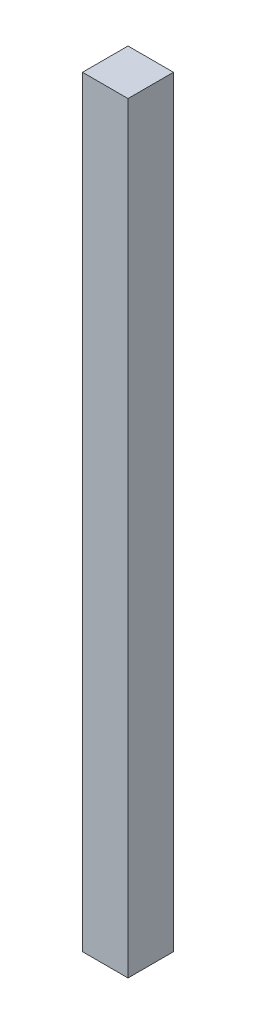
ISO-10303-21;
HEADER;
FILE_DESCRIPTION(('STEP AP214'),'2;1');
FILE_NAME('part.step','',(''),(''),'','','');
FILE_SCHEMA(('AUTOMOTIVE_DESIGN { 1 0 10303 214 1 1 1 1 }'));
ENDSEC;
DATA;
#1=APPLICATION_CONTEXT('core data for automotive mechanical design processes');
#2=APPLICATION_PROTOCOL_DEFINITION('international standard','automotive_design',2000,#1);
#3=PRODUCT_CONTEXT('',#1,'mechanical');
#4=PRODUCT('Part','Part','',(#3));
#5=PRODUCT_RELATED_PRODUCT_CATEGORY('part','',(#4));
#6=PRODUCT_DEFINITION_FORMATION('','',#4);
#7=PRODUCT_DEFINITION_CONTEXT('part definition',#1,'design');
#8=PRODUCT_DEFINITION('design','',#6,#7);
#9=PRODUCT_DEFINITION_SHAPE('','',#8);
#10=(LENGTH_UNIT() NAMED_UNIT(*) SI_UNIT(.MILLI.,.METRE.));
#11=(NAMED_UNIT(*) PLANE_ANGLE_UNIT() SI_UNIT($,.RADIAN.));
#12=(NAMED_UNIT(*) SI_UNIT($,.STERADIAN.) SOLID_ANGLE_UNIT());
#13=UNCERTAINTY_MEASURE_WITH_UNIT(LENGTH_MEASURE(1.E-05),#10,'distance_accuracy_value','');
#14=(GEOMETRIC_REPRESENTATION_CONTEXT(3) GLOBAL_UNCERTAINTY_ASSIGNED_CONTEXT((#13)) GLOBAL_UNIT_ASSIGNED_CONTEXT((#10,
#11,#12)) REPRESENTATION_CONTEXT('',''));
#15=CARTESIAN_POINT('',(0.,0.,0.));
#16=DIRECTION('',(0.,0.,1.));
#17=DIRECTION('',(1.,0.,0.));
#18=AXIS2_PLACEMENT_3D('',#15,#16,#17);
#19=CARTESIAN_POINT('',(25.4,850.392,25.4));
#20=DIRECTION('',(-1.,0.,0.));
#21=DIRECTION('',(0.,0.,1.));
#22=AXIS2_PLACEMENT_3D('',#19,#20,#21);
#23=PLANE('',#22);
#24=DIRECTION('',(0.,0.,-1.));
#25=VECTOR('',#24,1.);
#26=CARTESIAN_POINT('',(25.4,0.,25.4));
#27=LINE('',#26,#25);
#28=CARTESIAN_POINT('',(25.4,0.,25.4));
#29=VERTEX_POINT('',#28);
#30=CARTESIAN_POINT('',(25.4,0.,-25.4));
#31=VERTEX_POINT('',#30);
#32=EDGE_CURVE('E111',#29,#31,#27,.T.);
#33=ORIENTED_EDGE('',*,*,#32,.T.);
#34=DIRECTION('',(0.,-1.,0.));
#35=VECTOR('',#34,1.);
#36=CARTESIAN_POINT('',(25.4,850.392,-25.4));
#37=LINE('',#36,#35);
#38=CARTESIAN_POINT('',(25.4,850.392,-25.4));
#39=VERTEX_POINT('',#38);
#40=EDGE_CURVE('E11',#39,#31,#37,.T.);
#41=ORIENTED_EDGE('',*,*,#40,.F.);
#42=DIRECTION('',(0.,0.,-1.));
#43=VECTOR('',#42,1.);
#44=CARTESIAN_POINT('',(25.4,850.392,25.4));
#45=LINE('',#44,#43);
#46=CARTESIAN_POINT('',(25.4,850.392,25.4));
#47=VERTEX_POINT('',#46);
#48=EDGE_CURVE('E95',#47,#39,#45,.T.);
#49=ORIENTED_EDGE('',*,*,#48,.F.);
#50=DIRECTION('',(0.,-1.,0.));
#51=VECTOR('',#50,1.);
#52=CARTESIAN_POINT('',(25.4,850.392,25.4));
#53=LINE('',#52,#51);
#54=EDGE_CURVE('E107',#47,#29,#53,.T.);
#55=ORIENTED_EDGE('',*,*,#54,.T.);
#56=EDGE_LOOP('',(#33,#41,#49,#55));
#57=FACE_BOUND('',#56,.T.);
#58=ADVANCED_FACE('F43',(#57),#23,.F.);
#59=CARTESIAN_POINT('',(-25.4,850.392,-25.4));
#60=DIRECTION('',(0.,0.,1.));
#61=DIRECTION('',(1.,0.,0.));
#62=AXIS2_PLACEMENT_3D('',#59,#60,#61);
#63=PLANE('',#62);
#64=DIRECTION('',(-1.,0.,0.));
#65=VECTOR('',#64,1.);
#66=CARTESIAN_POINT('',(-25.4,0.,-25.4));
#67=LINE('',#66,#65);
#68=CARTESIAN_POINT('',(-25.4,0.,-25.4));
#69=VERTEX_POINT('',#68);
#70=EDGE_CURVE('E100',#31,#69,#67,.T.);
#71=ORIENTED_EDGE('',*,*,#70,.T.);
#72=DIRECTION('',(0.,-1.,0.));
#73=VECTOR('',#72,1.);
#74=CARTESIAN_POINT('',(-25.4,850.392,-25.4));
#75=LINE('',#74,#73);
#76=CARTESIAN_POINT('',(-25.4,850.392,-25.4));
#77=VERTEX_POINT('',#76);
#78=EDGE_CURVE('E52',#77,#69,#75,.T.);
#79=ORIENTED_EDGE('',*,*,#78,.F.);
#80=DIRECTION('',(-1.,0.,0.));
#81=VECTOR('',#80,1.);
#82=CARTESIAN_POINT('',(-25.4,850.392,-25.4));
#83=LINE('',#82,#81);
#84=EDGE_CURVE('E90',#39,#77,#83,.T.);
#85=ORIENTED_EDGE('',*,*,#84,.F.);
#86=ORIENTED_EDGE('',*,*,#40,.T.);
#87=EDGE_LOOP('',(#71,#79,#85,#86));
#88=FACE_BOUND('',#87,.T.);
#89=ADVANCED_FACE('F99',(#88),#63,.F.);
#90=CARTESIAN_POINT('',(-25.4,850.392,25.4));
#91=DIRECTION('',(1.,0.,0.));
#92=DIRECTION('',(0.,0.,-1.));
#93=AXIS2_PLACEMENT_3D('',#90,#91,#92);
#94=PLANE('',#93);
#95=DIRECTION('',(0.,0.,1.));
#96=VECTOR('',#95,1.);
#97=CARTESIAN_POINT('',(-25.4,0.,25.4));
#98=LINE('',#97,#96);
#99=CARTESIAN_POINT('',(-25.4,0.,25.4));
#100=VERTEX_POINT('',#99);
#101=EDGE_CURVE('E77',#69,#100,#98,.T.);
#102=ORIENTED_EDGE('',*,*,#101,.T.);
#103=DIRECTION('',(0.,-1.,0.));
#104=VECTOR('',#103,1.);
#105=CARTESIAN_POINT('',(-25.4,850.392,25.4));
#106=LINE('',#105,#104);
#107=CARTESIAN_POINT('',(-25.4,850.392,25.4));
#108=VERTEX_POINT('',#107);
#109=EDGE_CURVE('E102',#108,#100,#106,.T.);
#110=ORIENTED_EDGE('',*,*,#109,.F.);
#111=DIRECTION('',(0.,0.,1.));
#112=VECTOR('',#111,1.);
#113=CARTESIAN_POINT('',(-25.4,850.392,25.4));
#114=LINE('',#113,#112);
#115=EDGE_CURVE('E93',#77,#108,#114,.T.);
#116=ORIENTED_EDGE('',*,*,#115,.F.);
#117=ORIENTED_EDGE('',*,*,#78,.T.);
#118=EDGE_LOOP('',(#102,#110,#116,#117));
#119=FACE_BOUND('',#118,.T.);
#120=ADVANCED_FACE('F103',(#119),#94,.F.);
#121=CARTESIAN_POINT('',(-25.4,850.392,25.4));
#122=DIRECTION('',(0.,0.,-1.));
#123=DIRECTION('',(-1.,0.,0.));
#124=AXIS2_PLACEMENT_3D('',#121,#122,#123);
#125=PLANE('',#124);
#126=DIRECTION('',(1.,0.,0.));
#127=VECTOR('',#126,1.);
#128=CARTESIAN_POINT('',(-25.4,0.,25.4));
#129=LINE('',#128,#127);
#130=EDGE_CURVE('E83',#100,#29,#129,.T.);
#131=ORIENTED_EDGE('',*,*,#130,.T.);
#132=ORIENTED_EDGE('',*,*,#54,.F.);
#133=DIRECTION('',(1.,0.,0.));
#134=VECTOR('',#133,1.);
#135=CARTESIAN_POINT('',(-25.4,850.392,25.4));
#136=LINE('',#135,#134);
#137=EDGE_CURVE('E60',#108,#47,#136,.T.);
#138=ORIENTED_EDGE('',*,*,#137,.F.);
#139=ORIENTED_EDGE('',*,*,#109,.T.);
#140=EDGE_LOOP('',(#131,#132,#138,#139));
#141=FACE_BOUND('',#140,.T.);
#142=ADVANCED_FACE('F124',(#141),#125,.F.);
#143=CARTESIAN_POINT('',(0.,850.392,0.));
#144=DIRECTION('',(0.,-1.,0.));
#145=DIRECTION('',(0.,0.,-1.));
#146=AXIS2_PLACEMENT_3D('',#143,#144,#145);
#147=PLANE('',#146);
#148=ORIENTED_EDGE('',*,*,#48,.T.);
#149=ORIENTED_EDGE('',*,*,#84,.T.);
#150=ORIENTED_EDGE('',*,*,#115,.T.);
#151=ORIENTED_EDGE('',*,*,#137,.T.);
#152=EDGE_LOOP('',(#148,#149,#150,#151));
#153=FACE_BOUND('',#152,.T.);
#154=ADVANCED_FACE('F91',(#153),#147,.F.);
#155=CARTESIAN_POINT('',(0.,0.,0.));
#156=DIRECTION('',(0.,-1.,0.));
#157=DIRECTION('',(0.,0.,-1.));
#158=AXIS2_PLACEMENT_3D('',#155,#156,#157);
#159=PLANE('',#158);
#160=ORIENTED_EDGE('',*,*,#32,.F.);
#161=ORIENTED_EDGE('',*,*,#130,.F.);
#162=ORIENTED_EDGE('',*,*,#101,.F.);
#163=ORIENTED_EDGE('',*,*,#70,.F.);
#164=EDGE_LOOP('',(#160,#161,#162,#163));
#165=FACE_BOUND('',#164,.T.);
#166=ADVANCED_FACE('F127',(#165),#159,.T.);
#167=CLOSED_SHELL('',(#58,#89,#120,#142,#154,#166));
#168=MANIFOLD_SOLID_BREP('B2',#167);
#169=ADVANCED_BREP_SHAPE_REPRESENTATION('',(#18,#168),#14);
#170=SHAPE_DEFINITION_REPRESENTATION(#9,#169);
ENDSEC;
END-ISO-10303-21;
